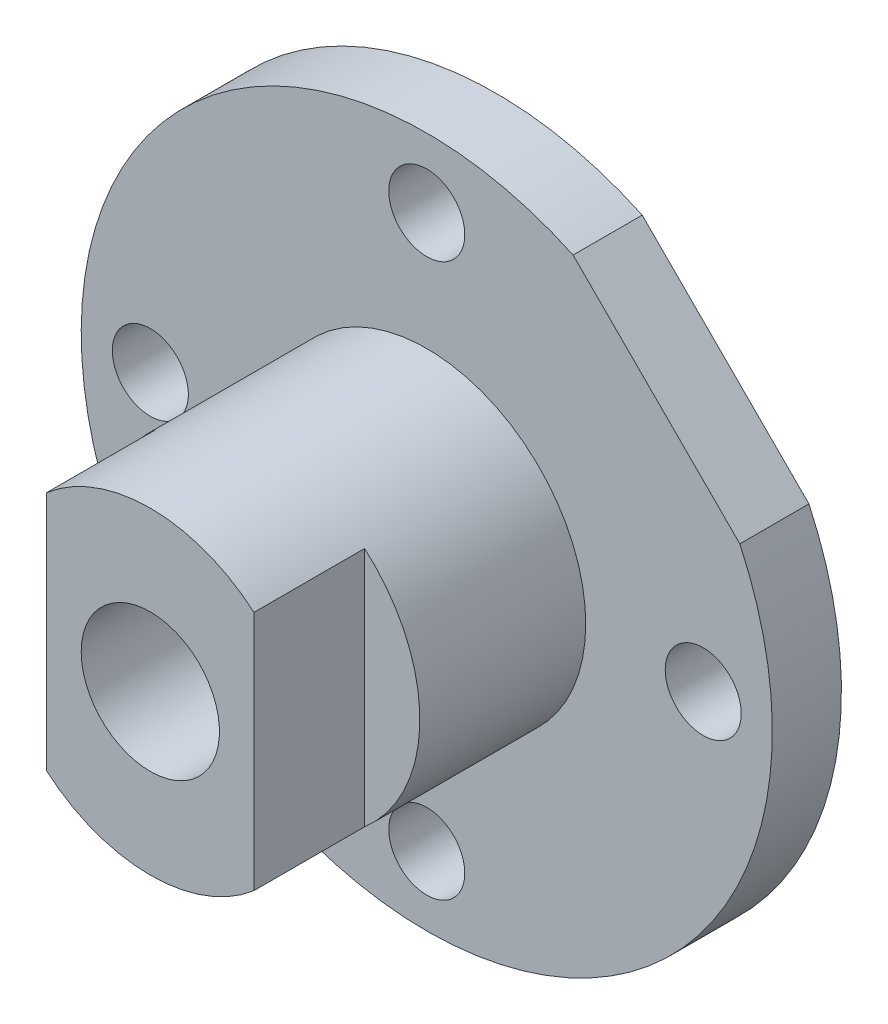
ISO-10303-21;
HEADER;
FILE_DESCRIPTION(('STEP AP214'),'2;1');
FILE_NAME('part.step','',(''),(''),'','','');
FILE_SCHEMA(('AUTOMOTIVE_DESIGN { 1 0 10303 214 1 1 1 1 }'));
ENDSEC;
DATA;
#1=APPLICATION_CONTEXT('core data for automotive mechanical design processes');
#2=APPLICATION_PROTOCOL_DEFINITION('international standard','automotive_design',2000,#1);
#3=PRODUCT_CONTEXT('',#1,'mechanical');
#4=PRODUCT('Part','Part','',(#3));
#5=PRODUCT_RELATED_PRODUCT_CATEGORY('part','',(#4));
#6=PRODUCT_DEFINITION_FORMATION('','',#4);
#7=PRODUCT_DEFINITION_CONTEXT('part definition',#1,'design');
#8=PRODUCT_DEFINITION('design','',#6,#7);
#9=PRODUCT_DEFINITION_SHAPE('','',#8);
#10=(LENGTH_UNIT() NAMED_UNIT(*) SI_UNIT(.MILLI.,.METRE.));
#11=(NAMED_UNIT(*) PLANE_ANGLE_UNIT() SI_UNIT($,.RADIAN.));
#12=(NAMED_UNIT(*) SI_UNIT($,.STERADIAN.) SOLID_ANGLE_UNIT());
#13=UNCERTAINTY_MEASURE_WITH_UNIT(LENGTH_MEASURE(1.E-05),#10,'distance_accuracy_value','');
#14=(GEOMETRIC_REPRESENTATION_CONTEXT(3) GLOBAL_UNCERTAINTY_ASSIGNED_CONTEXT((#13)) GLOBAL_UNIT_ASSIGNED_CONTEXT((#10,
#11,#12)) REPRESENTATION_CONTEXT('',''));
#15=CARTESIAN_POINT('',(0.,0.,0.));
#16=DIRECTION('',(0.,0.,1.));
#17=DIRECTION('',(1.,0.,0.));
#18=AXIS2_PLACEMENT_3D('',#15,#16,#17);
#19=CARTESIAN_POINT('',(0.,0.,25.));
#20=DIRECTION('',(0.,0.,-1.));
#21=DIRECTION('',(-1.,0.,0.));
#22=AXIS2_PLACEMENT_3D('',#19,#20,#21);
#23=CYLINDRICAL_SURFACE('',#22,11.5);
#24=CARTESIAN_POINT('',(0.,0.,5.));
#25=DIRECTION('',(0.,0.,-1.));
#26=DIRECTION('',(-1.,0.,0.));
#27=AXIS2_PLACEMENT_3D('',#24,#25,#26);
#28=CIRCLE('',#27,11.5);
#29=CARTESIAN_POINT('',(-11.5,0.,5.));
#30=VERTEX_POINT('',#29);
#31=EDGE_CURVE('E146',#30,#30,#28,.T.);
#32=ORIENTED_EDGE('',*,*,#31,.F.);
#33=EDGE_LOOP('',(#32));
#34=FACE_BOUND('',#33,.T.);
#35=DIRECTION('',(0.,0.,-1.));
#36=VECTOR('',#35,1.);
#37=CARTESIAN_POINT('',(-7.5,8.71779788708135,25.));
#38=LINE('',#37,#36);
#39=CARTESIAN_POINT('',(-7.5,8.71779788708134,25.));
#40=VERTEX_POINT('',#39);
#41=CARTESIAN_POINT('',(-7.5,8.71779788708134,17.));
#42=VERTEX_POINT('',#41);
#43=EDGE_CURVE('E176',#40,#42,#38,.T.);
#44=ORIENTED_EDGE('',*,*,#43,.F.);
#45=CARTESIAN_POINT('',(0.,0.,25.));
#46=DIRECTION('',(0.,0.,1.));
#47=DIRECTION('',(1.,0.,0.));
#48=AXIS2_PLACEMENT_3D('',#45,#46,#47);
#49=CIRCLE('',#48,11.5);
#50=CARTESIAN_POINT('',(7.5,8.71779788708135,25.));
#51=VERTEX_POINT('',#50);
#52=EDGE_CURVE('E143',#51,#40,#49,.T.);
#53=ORIENTED_EDGE('',*,*,#52,.F.);
#54=DIRECTION('',(0.,0.,-1.));
#55=VECTOR('',#54,1.);
#56=CARTESIAN_POINT('',(7.5,8.71779788708135,25.));
#57=LINE('',#56,#55);
#58=CARTESIAN_POINT('',(7.5,8.71779788708135,17.));
#59=VERTEX_POINT('',#58);
#60=EDGE_CURVE('E171',#51,#59,#57,.T.);
#61=ORIENTED_EDGE('',*,*,#60,.T.);
#62=CARTESIAN_POINT('',(0.,0.,17.));
#63=DIRECTION('',(0.,0.,-1.));
#64=DIRECTION('',(-1.,0.,0.));
#65=AXIS2_PLACEMENT_3D('',#62,#63,#64);
#66=CIRCLE('',#65,11.5);
#67=CARTESIAN_POINT('',(7.5,-8.71779788708135,17.));
#68=VERTEX_POINT('',#67);
#69=EDGE_CURVE('E155',#59,#68,#66,.T.);
#70=ORIENTED_EDGE('',*,*,#69,.T.);
#71=DIRECTION('',(0.,0.,-1.));
#72=VECTOR('',#71,1.);
#73=CARTESIAN_POINT('',(7.5,-8.71779788708135,25.));
#74=LINE('',#73,#72);
#75=CARTESIAN_POINT('',(7.5,-8.71779788708134,25.));
#76=VERTEX_POINT('',#75);
#77=EDGE_CURVE('E166',#68,#76,#74,.F.);
#78=ORIENTED_EDGE('',*,*,#77,.T.);
#79=CARTESIAN_POINT('',(-7.5,-8.71779788708135,25.));
#80=VERTEX_POINT('',#79);
#81=EDGE_CURVE('E137',#80,#76,#49,.T.);
#82=ORIENTED_EDGE('',*,*,#81,.F.);
#83=DIRECTION('',(0.,0.,-1.));
#84=VECTOR('',#83,1.);
#85=CARTESIAN_POINT('',(-7.5,-8.71779788708135,25.));
#86=LINE('',#85,#84);
#87=CARTESIAN_POINT('',(-7.5,-8.71779788708134,17.));
#88=VERTEX_POINT('',#87);
#89=EDGE_CURVE('E54',#88,#80,#86,.F.);
#90=ORIENTED_EDGE('',*,*,#89,.F.);
#91=CARTESIAN_POINT('',(0.,0.,17.));
#92=DIRECTION('',(0.,0.,1.));
#93=DIRECTION('',(1.,0.,0.));
#94=AXIS2_PLACEMENT_3D('',#91,#92,#93);
#95=CIRCLE('',#94,11.5);
#96=EDGE_CURVE('E11',#42,#88,#95,.T.);
#97=ORIENTED_EDGE('',*,*,#96,.F.);
#98=EDGE_LOOP('',(#44,#53,#61,#70,#78,#82,#90,#97));
#99=FACE_BOUND('',#98,.T.);
#100=ADVANCED_FACE('F32',(#34,#99),#23,.T.);
#101=CARTESIAN_POINT('',(0.,0.,25.));
#102=DIRECTION('',(0.,0.,1.));
#103=DIRECTION('',(1.,0.,0.));
#104=AXIS2_PLACEMENT_3D('',#101,#102,#103);
#105=PLANE('',#104);
#106=CARTESIAN_POINT('',(0.,0.,25.));
#107=DIRECTION('',(0.,0.,-1.));
#108=DIRECTION('',(-1.,0.,0.));
#109=AXIS2_PLACEMENT_3D('',#106,#107,#108);
#110=CIRCLE('',#109,5.);
#111=CARTESIAN_POINT('',(-5.,0.,25.));
#112=VERTEX_POINT('',#111);
#113=EDGE_CURVE('E135',#112,#112,#110,.T.);
#114=ORIENTED_EDGE('',*,*,#113,.T.);
#115=EDGE_LOOP('',(#114));
#116=FACE_BOUND('',#115,.T.);
#117=ORIENTED_EDGE('',*,*,#52,.T.);
#118=DIRECTION('',(0.,-1.,0.));
#119=VECTOR('',#118,1.);
#120=CARTESIAN_POINT('',(-7.5,0.,25.));
#121=LINE('',#120,#119);
#122=EDGE_CURVE('E39',#40,#80,#121,.T.);
#123=ORIENTED_EDGE('',*,*,#122,.T.);
#124=ORIENTED_EDGE('',*,*,#81,.T.);
#125=DIRECTION('',(0.,-1.,0.));
#126=VECTOR('',#125,1.);
#127=CARTESIAN_POINT('',(7.5,0.,25.));
#128=LINE('',#127,#126);
#129=EDGE_CURVE('E149',#51,#76,#128,.T.);
#130=ORIENTED_EDGE('',*,*,#129,.F.);
#131=EDGE_LOOP('',(#117,#123,#124,#130));
#132=FACE_BOUND('',#131,.T.);
#133=ADVANCED_FACE('F159',(#116,#132),#105,.T.);
#134=CARTESIAN_POINT('',(0.,0.,25.));
#135=DIRECTION('',(0.,0.,-1.));
#136=DIRECTION('',(-1.,0.,0.));
#137=AXIS2_PLACEMENT_3D('',#134,#135,#136);
#138=CYLINDRICAL_SURFACE('',#137,5.);
#139=ORIENTED_EDGE('',*,*,#113,.F.);
#140=EDGE_LOOP('',(#139));
#141=FACE_BOUND('',#140,.T.);
#142=CARTESIAN_POINT('',(0.,0.,10.));
#143=DIRECTION('',(0.,0.,-1.));
#144=DIRECTION('',(-1.,0.,0.));
#145=AXIS2_PLACEMENT_3D('',#142,#143,#144);
#146=CIRCLE('',#145,5.);
#147=CARTESIAN_POINT('',(-5.,0.,10.));
#148=VERTEX_POINT('',#147);
#149=EDGE_CURVE('E140',#148,#148,#146,.F.);
#150=ORIENTED_EDGE('',*,*,#149,.F.);
#151=EDGE_LOOP('',(#150));
#152=FACE_BOUND('',#151,.T.);
#153=ADVANCED_FACE('F266',(#141,#152),#138,.F.);
#154=CARTESIAN_POINT('',(0.,0.,5.));
#155=DIRECTION('',(0.,0.,-1.));
#156=DIRECTION('',(-1.,0.,0.));
#157=AXIS2_PLACEMENT_3D('',#154,#155,#156);
#158=PLANE('',#157);
#159=CARTESIAN_POINT('',(0.,20.,5.));
#160=DIRECTION('',(0.,0.,-1.));
#161=DIRECTION('',(-1.,0.,0.));
#162=AXIS2_PLACEMENT_3D('',#159,#160,#161);
#163=CIRCLE('',#162,2.74999999999999);
#164=CARTESIAN_POINT('',(-2.74999999999999,20.,5.));
#165=VERTEX_POINT('',#164);
#166=EDGE_CURVE('E484',#165,#165,#163,.T.);
#167=ORIENTED_EDGE('',*,*,#166,.T.);
#168=EDGE_LOOP('',(#167));
#169=FACE_BOUND('',#168,.T.);
#170=CARTESIAN_POINT('',(20.,0.,5.));
#171=DIRECTION('',(0.,0.,-1.));
#172=DIRECTION('',(-1.,0.,0.));
#173=AXIS2_PLACEMENT_3D('',#170,#171,#172);
#174=CIRCLE('',#173,2.74999999999999);
#175=CARTESIAN_POINT('',(17.25,0.,5.));
#176=VERTEX_POINT('',#175);
#177=EDGE_CURVE('E486',#176,#176,#174,.T.);
#178=ORIENTED_EDGE('',*,*,#177,.T.);
#179=EDGE_LOOP('',(#178));
#180=FACE_BOUND('',#179,.T.);
#181=CARTESIAN_POINT('',(-20.,0.,5.));
#182=DIRECTION('',(0.,0.,-1.));
#183=DIRECTION('',(-1.,0.,0.));
#184=AXIS2_PLACEMENT_3D('',#181,#182,#183);
#185=CIRCLE('',#184,2.74999999999999);
#186=CARTESIAN_POINT('',(-22.75,0.,5.));
#187=VERTEX_POINT('',#186);
#188=EDGE_CURVE('E308',#187,#187,#185,.T.);
#189=ORIENTED_EDGE('',*,*,#188,.T.);
#190=EDGE_LOOP('',(#189));
#191=FACE_BOUND('',#190,.T.);
#192=CARTESIAN_POINT('',(0.,-20.,5.));
#193=DIRECTION('',(0.,0.,-1.));
#194=DIRECTION('',(-1.,0.,0.));
#195=AXIS2_PLACEMENT_3D('',#192,#193,#194);
#196=CIRCLE('',#195,2.74999999999999);
#197=CARTESIAN_POINT('',(-2.74999999999999,-20.,5.));
#198=VERTEX_POINT('',#197);
#199=EDGE_CURVE('E307',#198,#198,#196,.T.);
#200=ORIENTED_EDGE('',*,*,#199,.T.);
#201=EDGE_LOOP('',(#200));
#202=FACE_BOUND('',#201,.T.);
#203=CARTESIAN_POINT('',(0.,0.,5.));
#204=DIRECTION('',(0.,0.,-1.));
#205=DIRECTION('',(-1.,0.,0.));
#206=AXIS2_PLACEMENT_3D('',#203,#204,#205);
#207=CIRCLE('',#206,25.);
#208=CARTESIAN_POINT('',(22.6481783987913,10.5858403169764,5.));
#209=VERTEX_POINT('',#208);
#210=CARTESIAN_POINT('',(10.5858403169765,22.6481783987913,5.));
#211=VERTEX_POINT('',#210);
#212=EDGE_CURVE('E131',#209,#211,#207,.T.);
#213=ORIENTED_EDGE('',*,*,#212,.F.);
#214=DIRECTION('',(-0.707106781186546,0.707106781186549,0.));
#215=VECTOR('',#214,1.);
#216=CARTESIAN_POINT('',(16.6170093578839,16.6170093578838,5.));
#217=LINE('',#216,#215);
#218=EDGE_CURVE('E132',#209,#211,#217,.T.);
#219=ORIENTED_EDGE('',*,*,#218,.T.);
#220=EDGE_LOOP('',(#213,#219));
#221=FACE_BOUND('',#220,.T.);
#222=ORIENTED_EDGE('',*,*,#31,.T.);
#223=EDGE_LOOP('',(#222));
#224=FACE_BOUND('',#223,.T.);
#225=ADVANCED_FACE('F271',(#169,#180,#191,#202,#221,#224),#158,.F.);
#226=CARTESIAN_POINT('',(0.,0.,5.));
#227=DIRECTION('',(0.,0.,-1.));
#228=DIRECTION('',(-1.,0.,0.));
#229=AXIS2_PLACEMENT_3D('',#226,#227,#228);
#230=CYLINDRICAL_SURFACE('',#229,25.);
#231=DIRECTION('',(0.,0.,-1.));
#232=VECTOR('',#231,1.);
#233=CARTESIAN_POINT('',(10.5858403169765,22.6481783987913,25.));
#234=LINE('',#233,#232);
#235=CARTESIAN_POINT('',(10.5858403169765,22.6481783987913,0.));
#236=VERTEX_POINT('',#235);
#237=EDGE_CURVE('E120',#211,#236,#234,.T.);
#238=ORIENTED_EDGE('',*,*,#237,.T.);
#239=CARTESIAN_POINT('',(0.,0.,0.));
#240=DIRECTION('',(0.,0.,-1.));
#241=DIRECTION('',(-1.,0.,0.));
#242=AXIS2_PLACEMENT_3D('',#239,#240,#241);
#243=CIRCLE('',#242,25.);
#244=CARTESIAN_POINT('',(22.6481783987913,10.5858403169764,0.));
#245=VERTEX_POINT('',#244);
#246=EDGE_CURVE('E129',#245,#236,#243,.T.);
#247=ORIENTED_EDGE('',*,*,#246,.F.);
#248=DIRECTION('',(0.,0.,-1.));
#249=VECTOR('',#248,1.);
#250=CARTESIAN_POINT('',(22.6481783987913,10.5858403169764,25.));
#251=LINE('',#250,#249);
#252=EDGE_CURVE('E46',#209,#245,#251,.T.);
#253=ORIENTED_EDGE('',*,*,#252,.F.);
#254=ORIENTED_EDGE('',*,*,#212,.T.);
#255=EDGE_LOOP('',(#238,#247,#253,#254));
#256=FACE_BOUND('',#255,.T.);
#257=ADVANCED_FACE('F128',(#256),#230,.T.);
#258=CARTESIAN_POINT('',(0.,0.,0.));
#259=DIRECTION('',(0.,0.,1.));
#260=DIRECTION('',(1.,0.,0.));
#261=AXIS2_PLACEMENT_3D('',#258,#259,#260);
#262=PLANE('',#261);
#263=CARTESIAN_POINT('',(0.,20.,0.));
#264=DIRECTION('',(0.,0.,-1.));
#265=DIRECTION('',(-1.,0.,0.));
#266=AXIS2_PLACEMENT_3D('',#263,#264,#265);
#267=CIRCLE('',#266,2.74999999999999);
#268=CARTESIAN_POINT('',(-2.74999999999999,20.,0.));
#269=VERTEX_POINT('',#268);
#270=EDGE_CURVE('E294',#269,#269,#267,.T.);
#271=ORIENTED_EDGE('',*,*,#270,.F.);
#272=EDGE_LOOP('',(#271));
#273=FACE_BOUND('',#272,.T.);
#274=CARTESIAN_POINT('',(20.,0.,0.));
#275=DIRECTION('',(0.,0.,-1.));
#276=DIRECTION('',(-1.,0.,0.));
#277=AXIS2_PLACEMENT_3D('',#274,#275,#276);
#278=CIRCLE('',#277,2.74999999999999);
#279=CARTESIAN_POINT('',(17.25,0.,0.));
#280=VERTEX_POINT('',#279);
#281=EDGE_CURVE('E298',#280,#280,#278,.T.);
#282=ORIENTED_EDGE('',*,*,#281,.F.);
#283=EDGE_LOOP('',(#282));
#284=FACE_BOUND('',#283,.T.);
#285=CARTESIAN_POINT('',(-20.,0.,0.));
#286=DIRECTION('',(0.,0.,-1.));
#287=DIRECTION('',(-1.,0.,0.));
#288=AXIS2_PLACEMENT_3D('',#285,#286,#287);
#289=CIRCLE('',#288,2.74999999999999);
#290=CARTESIAN_POINT('',(-22.75,0.,0.));
#291=VERTEX_POINT('',#290);
#292=EDGE_CURVE('E302',#291,#291,#289,.T.);
#293=ORIENTED_EDGE('',*,*,#292,.F.);
#294=EDGE_LOOP('',(#293));
#295=FACE_BOUND('',#294,.T.);
#296=CARTESIAN_POINT('',(0.,-20.,0.));
#297=DIRECTION('',(0.,0.,-1.));
#298=DIRECTION('',(-1.,0.,0.));
#299=AXIS2_PLACEMENT_3D('',#296,#297,#298);
#300=CIRCLE('',#299,2.74999999999999);
#301=CARTESIAN_POINT('',(-2.74999999999999,-20.,0.));
#302=VERTEX_POINT('',#301);
#303=EDGE_CURVE('E305',#302,#302,#300,.T.);
#304=ORIENTED_EDGE('',*,*,#303,.F.);
#305=EDGE_LOOP('',(#304));
#306=FACE_BOUND('',#305,.T.);
#307=DIRECTION('',(0.5,0.866025403784439,0.));
#308=VECTOR('',#307,1.);
#309=CARTESIAN_POINT('',(-8.,0.,0.));
#310=LINE('',#309,#308);
#311=CARTESIAN_POINT('',(-8.,0.,0.));
#312=VERTEX_POINT('',#311);
#313=CARTESIAN_POINT('',(-4.,6.92820323027551,0.));
#314=VERTEX_POINT('',#313);
#315=EDGE_CURVE('E201',#312,#314,#310,.T.);
#316=ORIENTED_EDGE('',*,*,#315,.F.);
#317=DIRECTION('',(-0.5,0.866025403784439,0.));
#318=VECTOR('',#317,1.);
#319=CARTESIAN_POINT('',(-4.,-6.92820323027551,0.));
#320=LINE('',#319,#318);
#321=CARTESIAN_POINT('',(-4.,-6.92820323027551,0.));
#322=VERTEX_POINT('',#321);
#323=EDGE_CURVE('E174',#322,#312,#320,.T.);
#324=ORIENTED_EDGE('',*,*,#323,.F.);
#325=DIRECTION('',(-1.,0.,0.));
#326=VECTOR('',#325,1.);
#327=CARTESIAN_POINT('',(4.,-6.92820323027551,0.));
#328=LINE('',#327,#326);
#329=CARTESIAN_POINT('',(4.,-6.92820323027551,0.));
#330=VERTEX_POINT('',#329);
#331=EDGE_CURVE('E184',#330,#322,#328,.T.);
#332=ORIENTED_EDGE('',*,*,#331,.F.);
#333=DIRECTION('',(-0.5,-0.866025403784439,0.));
#334=VECTOR('',#333,1.);
#335=CARTESIAN_POINT('',(8.,0.,0.));
#336=LINE('',#335,#334);
#337=CARTESIAN_POINT('',(8.,0.,0.));
#338=VERTEX_POINT('',#337);
#339=EDGE_CURVE('E210',#338,#330,#336,.T.);
#340=ORIENTED_EDGE('',*,*,#339,.F.);
#341=DIRECTION('',(0.5,-0.866025403784439,0.));
#342=VECTOR('',#341,1.);
#343=CARTESIAN_POINT('',(4.,6.92820323027551,0.));
#344=LINE('',#343,#342);
#345=CARTESIAN_POINT('',(4.,6.92820323027551,0.));
#346=VERTEX_POINT('',#345);
#347=EDGE_CURVE('E207',#346,#338,#344,.T.);
#348=ORIENTED_EDGE('',*,*,#347,.F.);
#349=DIRECTION('',(1.,0.,0.));
#350=VECTOR('',#349,1.);
#351=CARTESIAN_POINT('',(-4.,6.92820323027551,0.));
#352=LINE('',#351,#350);
#353=EDGE_CURVE('E204',#314,#346,#352,.T.);
#354=ORIENTED_EDGE('',*,*,#353,.F.);
#355=EDGE_LOOP('',(#316,#324,#332,#340,#348,#354));
#356=FACE_BOUND('',#355,.T.);
#357=ORIENTED_EDGE('',*,*,#246,.T.);
#358=DIRECTION('',(-0.707106781186546,0.707106781186549,0.));
#359=VECTOR('',#358,1.);
#360=CARTESIAN_POINT('',(22.6481783987913,10.5858403169764,0.));
#361=LINE('',#360,#359);
#362=EDGE_CURVE('E117',#245,#236,#361,.T.);
#363=ORIENTED_EDGE('',*,*,#362,.F.);
#364=EDGE_LOOP('',(#357,#363));
#365=FACE_BOUND('',#364,.T.);
#366=ADVANCED_FACE('F134',(#273,#284,#295,#306,#356,#365),#262,.F.);
#367=CARTESIAN_POINT('',(0.,0.,10.));
#368=DIRECTION('',(0.,0.,-1.));
#369=DIRECTION('',(-1.,0.,0.));
#370=AXIS2_PLACEMENT_3D('',#367,#368,#369);
#371=PLANE('',#370);
#372=DIRECTION('',(-0.5,0.866025403784439,0.));
#373=VECTOR('',#372,1.);
#374=CARTESIAN_POINT('',(-4.,-6.92820323027551,10.));
#375=LINE('',#374,#373);
#376=CARTESIAN_POINT('',(-4.,-6.92820323027551,10.));
#377=VERTEX_POINT('',#376);
#378=CARTESIAN_POINT('',(-8.,0.,10.));
#379=VERTEX_POINT('',#378);
#380=EDGE_CURVE('E180',#377,#379,#375,.T.);
#381=ORIENTED_EDGE('',*,*,#380,.T.);
#382=DIRECTION('',(0.5,0.866025403784439,0.));
#383=VECTOR('',#382,1.);
#384=CARTESIAN_POINT('',(-8.,0.,10.));
#385=LINE('',#384,#383);
#386=CARTESIAN_POINT('',(-4.,6.92820323027551,10.));
#387=VERTEX_POINT('',#386);
#388=EDGE_CURVE('E183',#379,#387,#385,.T.);
#389=ORIENTED_EDGE('',*,*,#388,.T.);
#390=DIRECTION('',(1.,0.,0.));
#391=VECTOR('',#390,1.);
#392=CARTESIAN_POINT('',(-4.,6.92820323027551,10.));
#393=LINE('',#392,#391);
#394=CARTESIAN_POINT('',(4.,6.92820323027551,10.));
#395=VERTEX_POINT('',#394);
#396=EDGE_CURVE('E187',#387,#395,#393,.T.);
#397=ORIENTED_EDGE('',*,*,#396,.T.);
#398=DIRECTION('',(0.5,-0.866025403784439,0.));
#399=VECTOR('',#398,1.);
#400=CARTESIAN_POINT('',(4.,6.92820323027551,10.));
#401=LINE('',#400,#399);
#402=CARTESIAN_POINT('',(8.,0.,10.));
#403=VERTEX_POINT('',#402);
#404=EDGE_CURVE('E190',#395,#403,#401,.T.);
#405=ORIENTED_EDGE('',*,*,#404,.T.);
#406=DIRECTION('',(-0.5,-0.866025403784439,0.));
#407=VECTOR('',#406,1.);
#408=CARTESIAN_POINT('',(8.,0.,10.));
#409=LINE('',#408,#407);
#410=CARTESIAN_POINT('',(4.,-6.92820323027551,10.));
#411=VERTEX_POINT('',#410);
#412=EDGE_CURVE('E193',#403,#411,#409,.T.);
#413=ORIENTED_EDGE('',*,*,#412,.T.);
#414=DIRECTION('',(-1.,0.,0.));
#415=VECTOR('',#414,1.);
#416=CARTESIAN_POINT('',(4.,-6.92820323027551,10.));
#417=LINE('',#416,#415);
#418=EDGE_CURVE('E196',#411,#377,#417,.T.);
#419=ORIENTED_EDGE('',*,*,#418,.T.);
#420=EDGE_LOOP('',(#381,#389,#397,#405,#413,#419));
#421=FACE_BOUND('',#420,.T.);
#422=ORIENTED_EDGE('',*,*,#149,.T.);
#423=EDGE_LOOP('',(#422));
#424=FACE_BOUND('',#423,.T.);
#425=ADVANCED_FACE('F242',(#421,#424),#371,.T.);
#426=CARTESIAN_POINT('',(-4.,-6.92820323027551,10.));
#427=DIRECTION('',(-0.866025403784439,-0.5,0.));
#428=DIRECTION('',(0.5,-0.866025403784439,0.));
#429=AXIS2_PLACEMENT_3D('',#426,#427,#428);
#430=PLANE('',#429);
#431=ORIENTED_EDGE('',*,*,#323,.T.);
#432=DIRECTION('',(0.,0.,-1.));
#433=VECTOR('',#432,1.);
#434=CARTESIAN_POINT('',(-8.,0.,10.));
#435=LINE('',#434,#433);
#436=EDGE_CURVE('E199',#379,#312,#435,.T.);
#437=ORIENTED_EDGE('',*,*,#436,.F.);
#438=ORIENTED_EDGE('',*,*,#380,.F.);
#439=DIRECTION('',(0.,0.,-1.));
#440=VECTOR('',#439,1.);
#441=CARTESIAN_POINT('',(-4.,-6.92820323027551,10.));
#442=LINE('',#441,#440);
#443=EDGE_CURVE('E152',#377,#322,#442,.T.);
#444=ORIENTED_EDGE('',*,*,#443,.T.);
#445=EDGE_LOOP('',(#431,#437,#438,#444));
#446=FACE_BOUND('',#445,.T.);
#447=ADVANCED_FACE('F245',(#446),#430,.F.);
#448=CARTESIAN_POINT('',(4.,-6.92820323027551,10.));
#449=DIRECTION('',(0.,-1.,0.));
#450=DIRECTION('',(1.,0.,0.));
#451=AXIS2_PLACEMENT_3D('',#448,#449,#450);
#452=PLANE('',#451);
#453=ORIENTED_EDGE('',*,*,#331,.T.);
#454=ORIENTED_EDGE('',*,*,#443,.F.);
#455=ORIENTED_EDGE('',*,*,#418,.F.);
#456=DIRECTION('',(0.,0.,-1.));
#457=VECTOR('',#456,1.);
#458=CARTESIAN_POINT('',(4.,-6.92820323027551,10.));
#459=LINE('',#458,#457);
#460=EDGE_CURVE('E216',#411,#330,#459,.T.);
#461=ORIENTED_EDGE('',*,*,#460,.T.);
#462=EDGE_LOOP('',(#453,#454,#455,#461));
#463=FACE_BOUND('',#462,.T.);
#464=ADVANCED_FACE('F247',(#463),#452,.F.);
#465=CARTESIAN_POINT('',(8.,0.,10.));
#466=DIRECTION('',(0.866025403784439,-0.5,0.));
#467=DIRECTION('',(0.5,0.866025403784439,0.));
#468=AXIS2_PLACEMENT_3D('',#465,#466,#467);
#469=PLANE('',#468);
#470=ORIENTED_EDGE('',*,*,#339,.T.);
#471=ORIENTED_EDGE('',*,*,#460,.F.);
#472=ORIENTED_EDGE('',*,*,#412,.F.);
#473=DIRECTION('',(0.,0.,-1.));
#474=VECTOR('',#473,1.);
#475=CARTESIAN_POINT('',(8.,0.,10.));
#476=LINE('',#475,#474);
#477=EDGE_CURVE('E218',#403,#338,#476,.T.);
#478=ORIENTED_EDGE('',*,*,#477,.T.);
#479=EDGE_LOOP('',(#470,#471,#472,#478));
#480=FACE_BOUND('',#479,.T.);
#481=ADVANCED_FACE('F249',(#480),#469,.F.);
#482=CARTESIAN_POINT('',(4.,6.92820323027551,10.));
#483=DIRECTION('',(0.866025403784439,0.5,0.));
#484=DIRECTION('',(-0.5,0.866025403784439,0.));
#485=AXIS2_PLACEMENT_3D('',#482,#483,#484);
#486=PLANE('',#485);
#487=ORIENTED_EDGE('',*,*,#347,.T.);
#488=ORIENTED_EDGE('',*,*,#477,.F.);
#489=ORIENTED_EDGE('',*,*,#404,.F.);
#490=DIRECTION('',(0.,0.,-1.));
#491=VECTOR('',#490,1.);
#492=CARTESIAN_POINT('',(4.,6.92820323027551,10.));
#493=LINE('',#492,#491);
#494=EDGE_CURVE('E220',#395,#346,#493,.T.);
#495=ORIENTED_EDGE('',*,*,#494,.T.);
#496=EDGE_LOOP('',(#487,#488,#489,#495));
#497=FACE_BOUND('',#496,.T.);
#498=ADVANCED_FACE('F252',(#497),#486,.F.);
#499=CARTESIAN_POINT('',(-4.,6.92820323027551,10.));
#500=DIRECTION('',(0.,1.,0.));
#501=DIRECTION('',(0.,0.,1.));
#502=AXIS2_PLACEMENT_3D('',#499,#500,#501);
#503=PLANE('',#502);
#504=ORIENTED_EDGE('',*,*,#353,.T.);
#505=ORIENTED_EDGE('',*,*,#494,.F.);
#506=ORIENTED_EDGE('',*,*,#396,.F.);
#507=DIRECTION('',(0.,0.,-1.));
#508=VECTOR('',#507,1.);
#509=CARTESIAN_POINT('',(-4.,6.92820323027551,10.));
#510=LINE('',#509,#508);
#511=EDGE_CURVE('E222',#387,#314,#510,.T.);
#512=ORIENTED_EDGE('',*,*,#511,.T.);
#513=EDGE_LOOP('',(#504,#505,#506,#512));
#514=FACE_BOUND('',#513,.T.);
#515=ADVANCED_FACE('F238',(#514),#503,.F.);
#516=CARTESIAN_POINT('',(-8.,0.,10.));
#517=DIRECTION('',(-0.866025403784438,0.5,0.));
#518=DIRECTION('',(-0.5,-0.866025403784439,0.));
#519=AXIS2_PLACEMENT_3D('',#516,#517,#518);
#520=PLANE('',#519);
#521=ORIENTED_EDGE('',*,*,#315,.T.);
#522=ORIENTED_EDGE('',*,*,#511,.F.);
#523=ORIENTED_EDGE('',*,*,#388,.F.);
#524=ORIENTED_EDGE('',*,*,#436,.T.);
#525=EDGE_LOOP('',(#521,#522,#523,#524));
#526=FACE_BOUND('',#525,.T.);
#527=ADVANCED_FACE('F228',(#526),#520,.F.);
#528=CARTESIAN_POINT('',(11.5,-25.,17.));
#529=DIRECTION('',(0.,0.,-1.));
#530=DIRECTION('',(-1.,0.,0.));
#531=AXIS2_PLACEMENT_3D('',#528,#529,#530);
#532=PLANE('',#531);
#533=DIRECTION('',(0.,1.,0.));
#534=VECTOR('',#533,1.);
#535=CARTESIAN_POINT('',(7.5,-25.,17.));
#536=LINE('',#535,#534);
#537=EDGE_CURVE('E172',#68,#59,#536,.T.);
#538=ORIENTED_EDGE('',*,*,#537,.F.);
#539=ORIENTED_EDGE('',*,*,#69,.F.);
#540=EDGE_LOOP('',(#538,#539));
#541=FACE_BOUND('',#540,.T.);
#542=ADVANCED_FACE('F331',(#541),#532,.F.);
#543=CARTESIAN_POINT('',(7.5,-25.,25.));
#544=DIRECTION('',(-1.,0.,0.));
#545=DIRECTION('',(0.,0.,1.));
#546=AXIS2_PLACEMENT_3D('',#543,#544,#545);
#547=PLANE('',#546);
#548=ORIENTED_EDGE('',*,*,#129,.T.);
#549=ORIENTED_EDGE('',*,*,#77,.F.);
#550=ORIENTED_EDGE('',*,*,#537,.T.);
#551=ORIENTED_EDGE('',*,*,#60,.F.);
#552=EDGE_LOOP('',(#548,#549,#550,#551));
#553=FACE_BOUND('',#552,.T.);
#554=ADVANCED_FACE('F323',(#553),#547,.F.);
#555=CARTESIAN_POINT('',(-11.5,-25.,17.));
#556=DIRECTION('',(0.,0.,1.));
#557=DIRECTION('',(1.,0.,0.));
#558=AXIS2_PLACEMENT_3D('',#555,#556,#557);
#559=PLANE('',#558);
#560=DIRECTION('',(0.,1.,0.));
#561=VECTOR('',#560,1.);
#562=CARTESIAN_POINT('',(-7.5,-25.,17.));
#563=LINE('',#562,#561);
#564=EDGE_CURVE('E311',#88,#42,#563,.T.);
#565=ORIENTED_EDGE('',*,*,#564,.T.);
#566=ORIENTED_EDGE('',*,*,#96,.T.);
#567=EDGE_LOOP('',(#565,#566));
#568=FACE_BOUND('',#567,.T.);
#569=ADVANCED_FACE('F321',(#568),#559,.T.);
#570=CARTESIAN_POINT('',(-7.5,-25.,25.));
#571=DIRECTION('',(-1.,0.,0.));
#572=DIRECTION('',(0.,0.,1.));
#573=AXIS2_PLACEMENT_3D('',#570,#571,#572);
#574=PLANE('',#573);
#575=ORIENTED_EDGE('',*,*,#43,.T.);
#576=ORIENTED_EDGE('',*,*,#564,.F.);
#577=ORIENTED_EDGE('',*,*,#89,.T.);
#578=ORIENTED_EDGE('',*,*,#122,.F.);
#579=EDGE_LOOP('',(#575,#576,#577,#578));
#580=FACE_BOUND('',#579,.T.);
#581=ADVANCED_FACE('F319',(#580),#574,.T.);
#582=CARTESIAN_POINT('',(0.,-20.,0.));
#583=DIRECTION('',(0.,0.,-1.));
#584=DIRECTION('',(-1.,0.,0.));
#585=AXIS2_PLACEMENT_3D('',#582,#583,#584);
#586=CYLINDRICAL_SURFACE('',#585,2.74999999999999);
#587=ORIENTED_EDGE('',*,*,#303,.T.);
#588=EDGE_LOOP('',(#587));
#589=FACE_BOUND('',#588,.T.);
#590=ORIENTED_EDGE('',*,*,#199,.F.);
#591=EDGE_LOOP('',(#590));
#592=FACE_BOUND('',#591,.T.);
#593=ADVANCED_FACE('F329',(#589,#592),#586,.F.);
#594=CARTESIAN_POINT('',(-20.,0.,0.));
#595=DIRECTION('',(0.,0.,-1.));
#596=DIRECTION('',(-1.,0.,0.));
#597=AXIS2_PLACEMENT_3D('',#594,#595,#596);
#598=CYLINDRICAL_SURFACE('',#597,2.74999999999999);
#599=ORIENTED_EDGE('',*,*,#292,.T.);
#600=EDGE_LOOP('',(#599));
#601=FACE_BOUND('',#600,.T.);
#602=ORIENTED_EDGE('',*,*,#188,.F.);
#603=EDGE_LOOP('',(#602));
#604=FACE_BOUND('',#603,.T.);
#605=ADVANCED_FACE('F388',(#601,#604),#598,.F.);
#606=CARTESIAN_POINT('',(20.,0.,0.));
#607=DIRECTION('',(0.,0.,-1.));
#608=DIRECTION('',(-1.,0.,0.));
#609=AXIS2_PLACEMENT_3D('',#606,#607,#608);
#610=CYLINDRICAL_SURFACE('',#609,2.74999999999999);
#611=ORIENTED_EDGE('',*,*,#281,.T.);
#612=EDGE_LOOP('',(#611));
#613=FACE_BOUND('',#612,.T.);
#614=ORIENTED_EDGE('',*,*,#177,.F.);
#615=EDGE_LOOP('',(#614));
#616=FACE_BOUND('',#615,.T.);
#617=ADVANCED_FACE('F396',(#613,#616),#610,.F.);
#618=CARTESIAN_POINT('',(0.,20.,0.));
#619=DIRECTION('',(0.,0.,-1.));
#620=DIRECTION('',(-1.,0.,0.));
#621=AXIS2_PLACEMENT_3D('',#618,#619,#620);
#622=CYLINDRICAL_SURFACE('',#621,2.74999999999999);
#623=ORIENTED_EDGE('',*,*,#270,.T.);
#624=EDGE_LOOP('',(#623));
#625=FACE_BOUND('',#624,.T.);
#626=ORIENTED_EDGE('',*,*,#166,.F.);
#627=EDGE_LOOP('',(#626));
#628=FACE_BOUND('',#627,.T.);
#629=ADVANCED_FACE('F405',(#625,#628),#622,.F.);
#630=CARTESIAN_POINT('',(22.6481783987913,10.5858403169764,25.));
#631=DIRECTION('',(-0.707106781186549,-0.707106781186546,0.));
#632=DIRECTION('',(0.707106781186546,-0.707106781186549,0.));
#633=AXIS2_PLACEMENT_3D('',#630,#631,#632);
#634=PLANE('',#633);
#635=ORIENTED_EDGE('',*,*,#252,.T.);
#636=ORIENTED_EDGE('',*,*,#362,.T.);
#637=ORIENTED_EDGE('',*,*,#237,.F.);
#638=ORIENTED_EDGE('',*,*,#218,.F.);
#639=EDGE_LOOP('',(#635,#636,#637,#638));
#640=FACE_BOUND('',#639,.T.);
#641=ADVANCED_FACE('F119',(#640),#634,.F.);
#642=CLOSED_SHELL('',(#100,#133,#153,#225,#257,#366,#425,#447,#464,#481,#498,#515,#527,#542,
#554,#569,#581,#593,#605,#617,#629,#641));
#643=MANIFOLD_SOLID_BREP('B2',#642);
#644=ADVANCED_BREP_SHAPE_REPRESENTATION('',(#18,#643),#14);
#645=SHAPE_DEFINITION_REPRESENTATION(#9,#644);
ENDSEC;
END-ISO-10303-21;
